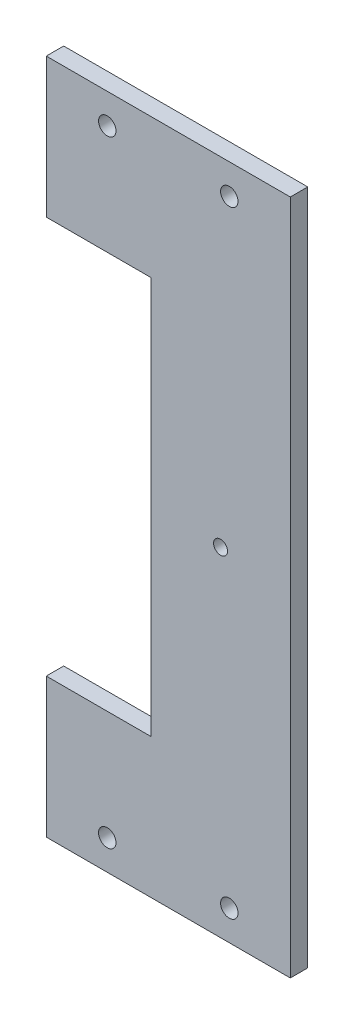
ISO-10303-21;
HEADER;
FILE_DESCRIPTION(('STEP AP214'),'2;1');
FILE_NAME('part.step','',(''),(''),'','','');
FILE_SCHEMA(('AUTOMOTIVE_DESIGN { 1 0 10303 214 1 1 1 1 }'));
ENDSEC;
DATA;
#1=APPLICATION_CONTEXT('core data for automotive mechanical design processes');
#2=APPLICATION_PROTOCOL_DEFINITION('international standard','automotive_design',2000,#1);
#3=PRODUCT_CONTEXT('',#1,'mechanical');
#4=PRODUCT('Part','Part','',(#3));
#5=PRODUCT_RELATED_PRODUCT_CATEGORY('part','',(#4));
#6=PRODUCT_DEFINITION_FORMATION('','',#4);
#7=PRODUCT_DEFINITION_CONTEXT('part definition',#1,'design');
#8=PRODUCT_DEFINITION('design','',#6,#7);
#9=PRODUCT_DEFINITION_SHAPE('','',#8);
#10=(LENGTH_UNIT() NAMED_UNIT(*) SI_UNIT(.MILLI.,.METRE.));
#11=(NAMED_UNIT(*) PLANE_ANGLE_UNIT() SI_UNIT($,.RADIAN.));
#12=(NAMED_UNIT(*) SI_UNIT($,.STERADIAN.) SOLID_ANGLE_UNIT());
#13=UNCERTAINTY_MEASURE_WITH_UNIT(LENGTH_MEASURE(1.E-05),#10,'distance_accuracy_value','');
#14=(GEOMETRIC_REPRESENTATION_CONTEXT(3) GLOBAL_UNCERTAINTY_ASSIGNED_CONTEXT((#13)) GLOBAL_UNIT_ASSIGNED_CONTEXT((#10,
#11,#12)) REPRESENTATION_CONTEXT('',''));
#15=CARTESIAN_POINT('',(0.,0.,0.));
#16=DIRECTION('',(0.,0.,1.));
#17=DIRECTION('',(1.,0.,0.));
#18=AXIS2_PLACEMENT_3D('',#15,#16,#17);
#19=CARTESIAN_POINT('',(0.,0.,5.));
#20=DIRECTION('',(0.,0.,-1.));
#21=DIRECTION('',(-1.,0.,0.));
#22=AXIS2_PLACEMENT_3D('',#19,#20,#21);
#23=PLANE('',#22);
#24=DIRECTION('',(-1.,0.,0.));
#25=VECTOR('',#24,1.);
#26=CARTESIAN_POINT('',(-24.2182890855457,78.1150442477876,5.));
#27=LINE('',#26,#25);
#28=CARTESIAN_POINT('',(45.7817109144543,78.1150442477876,5.));
#29=VERTEX_POINT('',#28);
#30=CARTESIAN_POINT('',(-24.2182890855457,78.1150442477876,5.));
#31=VERTEX_POINT('',#30);
#32=EDGE_CURVE('E145',#29,#31,#27,.T.);
#33=ORIENTED_EDGE('',*,*,#32,.T.);
#34=DIRECTION('',(0.,-1.,0.));
#35=VECTOR('',#34,1.);
#36=CARTESIAN_POINT('',(-24.2182890855457,78.1150442477876,5.));
#37=LINE('',#36,#35);
#38=CARTESIAN_POINT('',(-24.2182890855457,38.1150442477876,5.));
#39=VERTEX_POINT('',#38);
#40=EDGE_CURVE('E93',#31,#39,#37,.T.);
#41=ORIENTED_EDGE('',*,*,#40,.T.);
#42=DIRECTION('',(1.,0.,0.));
#43=VECTOR('',#42,1.);
#44=CARTESIAN_POINT('',(-24.2182890855457,38.1150442477876,5.));
#45=LINE('',#44,#43);
#46=CARTESIAN_POINT('',(5.78171091445426,38.1150442477876,5.));
#47=VERTEX_POINT('',#46);
#48=EDGE_CURVE('E160',#39,#47,#45,.T.);
#49=ORIENTED_EDGE('',*,*,#48,.T.);
#50=DIRECTION('',(0.,-1.,0.));
#51=VECTOR('',#50,1.);
#52=CARTESIAN_POINT('',(5.78171091445426,38.1150442477876,5.));
#53=LINE('',#52,#51);
#54=CARTESIAN_POINT('',(5.78171091445426,-75.8849557522124,5.));
#55=VERTEX_POINT('',#54);
#56=EDGE_CURVE('E173',#47,#55,#53,.T.);
#57=ORIENTED_EDGE('',*,*,#56,.T.);
#58=DIRECTION('',(-1.,0.,0.));
#59=VECTOR('',#58,1.);
#60=CARTESIAN_POINT('',(-24.2182890855457,-75.8849557522124,5.));
#61=LINE('',#60,#59);
#62=CARTESIAN_POINT('',(-24.2182890855457,-75.8849557522124,5.));
#63=VERTEX_POINT('',#62);
#64=EDGE_CURVE('E112',#55,#63,#61,.T.);
#65=ORIENTED_EDGE('',*,*,#64,.T.);
#66=DIRECTION('',(0.,-1.,0.));
#67=VECTOR('',#66,1.);
#68=CARTESIAN_POINT('',(-24.2182890855457,-115.884955752212,5.));
#69=LINE('',#68,#67);
#70=CARTESIAN_POINT('',(-24.2182890855457,-115.884955752212,5.));
#71=VERTEX_POINT('',#70);
#72=EDGE_CURVE('E106',#63,#71,#69,.T.);
#73=ORIENTED_EDGE('',*,*,#72,.T.);
#74=DIRECTION('',(1.,0.,0.));
#75=VECTOR('',#74,1.);
#76=CARTESIAN_POINT('',(-24.2182890855457,-115.884955752212,5.));
#77=LINE('',#76,#75);
#78=CARTESIAN_POINT('',(45.7817109144543,-115.884955752212,5.));
#79=VERTEX_POINT('',#78);
#80=EDGE_CURVE('E110',#71,#79,#77,.T.);
#81=ORIENTED_EDGE('',*,*,#80,.T.);
#82=DIRECTION('',(0.,1.,0.));
#83=VECTOR('',#82,1.);
#84=CARTESIAN_POINT('',(45.7817109144543,78.1150442477876,5.));
#85=LINE('',#84,#83);
#86=EDGE_CURVE('E50',#79,#29,#85,.T.);
#87=ORIENTED_EDGE('',*,*,#86,.T.);
#88=EDGE_LOOP('',(#33,#41,#49,#57,#65,#73,#81,#87));
#89=FACE_BOUND('',#88,.T.);
#90=CARTESIAN_POINT('',(25.7817109144543,-18.8849557522124,5.));
#91=DIRECTION('',(0.,0.,1.));
#92=DIRECTION('',(1.,0.,0.));
#93=AXIS2_PLACEMENT_3D('',#90,#91,#92);
#94=CIRCLE('',#93,2.00000000000001);
#95=CARTESIAN_POINT('',(27.7817109144543,-18.8849557522124,5.));
#96=VERTEX_POINT('',#95);
#97=EDGE_CURVE('E134',#96,#96,#94,.T.);
#98=ORIENTED_EDGE('',*,*,#97,.F.);
#99=EDGE_LOOP('',(#98));
#100=FACE_BOUND('',#99,.T.);
#101=CARTESIAN_POINT('',(-6.71828908554573,-107.285805208705,5.));
#102=DIRECTION('',(0.,0.,1.));
#103=DIRECTION('',(1.,0.,0.));
#104=AXIS2_PLACEMENT_3D('',#101,#102,#103);
#105=CIRCLE('',#104,2.5);
#106=CARTESIAN_POINT('',(-4.21828908554573,-107.285805208705,5.));
#107=VERTEX_POINT('',#106);
#108=EDGE_CURVE('E182',#107,#107,#105,.T.);
#109=ORIENTED_EDGE('',*,*,#108,.F.);
#110=EDGE_LOOP('',(#109));
#111=FACE_BOUND('',#110,.T.);
#112=CARTESIAN_POINT('',(28.2817109144543,-107.285805208705,5.));
#113=DIRECTION('',(0.,0.,1.));
#114=DIRECTION('',(-1.,0.,0.));
#115=AXIS2_PLACEMENT_3D('',#112,#113,#114);
#116=CIRCLE('',#115,2.5);
#117=CARTESIAN_POINT('',(25.7817109144543,-107.285805208705,5.));
#118=VERTEX_POINT('',#117);
#119=EDGE_CURVE('E188',#118,#118,#116,.T.);
#120=ORIENTED_EDGE('',*,*,#119,.F.);
#121=EDGE_LOOP('',(#120));
#122=FACE_BOUND('',#121,.T.);
#123=CARTESIAN_POINT('',(28.2817109144543,69.5158937042806,5.));
#124=DIRECTION('',(0.,0.,1.));
#125=DIRECTION('',(1.,0.,0.));
#126=AXIS2_PLACEMENT_3D('',#123,#124,#125);
#127=CIRCLE('',#126,2.5);
#128=CARTESIAN_POINT('',(30.7817109144543,69.5158937042806,5.));
#129=VERTEX_POINT('',#128);
#130=EDGE_CURVE('E194',#129,#129,#127,.T.);
#131=ORIENTED_EDGE('',*,*,#130,.F.);
#132=EDGE_LOOP('',(#131));
#133=FACE_BOUND('',#132,.T.);
#134=CARTESIAN_POINT('',(-6.71828908554573,69.5158937042806,5.));
#135=DIRECTION('',(0.,0.,1.));
#136=DIRECTION('',(-1.,0.,0.));
#137=AXIS2_PLACEMENT_3D('',#134,#135,#136);
#138=CIRCLE('',#137,2.5);
#139=CARTESIAN_POINT('',(-9.21828908554573,69.5158937042806,5.));
#140=VERTEX_POINT('',#139);
#141=EDGE_CURVE('E200',#140,#140,#138,.T.);
#142=ORIENTED_EDGE('',*,*,#141,.F.);
#143=EDGE_LOOP('',(#142));
#144=FACE_BOUND('',#143,.T.);
#145=ADVANCED_FACE('F33',(#89,#100,#111,#122,#133,#144),#23,.F.);
#146=CARTESIAN_POINT('',(0.,0.,0.));
#147=DIRECTION('',(0.,0.,-1.));
#148=DIRECTION('',(-1.,0.,0.));
#149=AXIS2_PLACEMENT_3D('',#146,#147,#148);
#150=PLANE('',#149);
#151=CARTESIAN_POINT('',(28.2817109144543,69.5158937042806,0.));
#152=DIRECTION('',(0.,0.,1.));
#153=DIRECTION('',(1.,0.,0.));
#154=AXIS2_PLACEMENT_3D('',#151,#152,#153);
#155=CIRCLE('',#154,2.5);
#156=CARTESIAN_POINT('',(30.7817109144543,69.5158937042806,0.));
#157=VERTEX_POINT('',#156);
#158=EDGE_CURVE('E197',#157,#157,#155,.T.);
#159=ORIENTED_EDGE('',*,*,#158,.T.);
#160=EDGE_LOOP('',(#159));
#161=FACE_BOUND('',#160,.T.);
#162=CARTESIAN_POINT('',(-6.71828908554573,-107.285805208705,0.));
#163=DIRECTION('',(0.,0.,1.));
#164=DIRECTION('',(1.,0.,0.));
#165=AXIS2_PLACEMENT_3D('',#162,#163,#164);
#166=CIRCLE('',#165,2.5);
#167=CARTESIAN_POINT('',(-4.21828908554573,-107.285805208705,0.));
#168=VERTEX_POINT('',#167);
#169=EDGE_CURVE('E185',#168,#168,#166,.T.);
#170=ORIENTED_EDGE('',*,*,#169,.T.);
#171=EDGE_LOOP('',(#170));
#172=FACE_BOUND('',#171,.T.);
#173=DIRECTION('',(-1.,0.,0.));
#174=VECTOR('',#173,1.);
#175=CARTESIAN_POINT('',(-24.2182890855457,78.1150442477876,0.));
#176=LINE('',#175,#174);
#177=CARTESIAN_POINT('',(45.7817109144543,78.1150442477876,0.));
#178=VERTEX_POINT('',#177);
#179=CARTESIAN_POINT('',(-24.2182890855457,78.1150442477876,0.));
#180=VERTEX_POINT('',#179);
#181=EDGE_CURVE('E130',#178,#180,#176,.T.);
#182=ORIENTED_EDGE('',*,*,#181,.F.);
#183=DIRECTION('',(0.,1.,0.));
#184=VECTOR('',#183,1.);
#185=CARTESIAN_POINT('',(45.7817109144543,78.1150442477876,0.));
#186=LINE('',#185,#184);
#187=CARTESIAN_POINT('',(45.7817109144543,-115.884955752212,0.));
#188=VERTEX_POINT('',#187);
#189=EDGE_CURVE('E85',#188,#178,#186,.T.);
#190=ORIENTED_EDGE('',*,*,#189,.F.);
#191=DIRECTION('',(1.,0.,0.));
#192=VECTOR('',#191,1.);
#193=CARTESIAN_POINT('',(-24.2182890855457,-115.884955752212,0.));
#194=LINE('',#193,#192);
#195=CARTESIAN_POINT('',(-24.2182890855457,-115.884955752212,0.));
#196=VERTEX_POINT('',#195);
#197=EDGE_CURVE('E79',#196,#188,#194,.T.);
#198=ORIENTED_EDGE('',*,*,#197,.F.);
#199=DIRECTION('',(0.,-1.,0.));
#200=VECTOR('',#199,1.);
#201=CARTESIAN_POINT('',(-24.2182890855457,-115.884955752212,0.));
#202=LINE('',#201,#200);
#203=CARTESIAN_POINT('',(-24.2182890855457,-75.8849557522124,0.));
#204=VERTEX_POINT('',#203);
#205=EDGE_CURVE('E120',#204,#196,#202,.T.);
#206=ORIENTED_EDGE('',*,*,#205,.F.);
#207=DIRECTION('',(-1.,0.,0.));
#208=VECTOR('',#207,1.);
#209=CARTESIAN_POINT('',(-24.2182890855457,-75.8849557522124,0.));
#210=LINE('',#209,#208);
#211=CARTESIAN_POINT('',(5.78171091445426,-75.8849557522124,0.));
#212=VERTEX_POINT('',#211);
#213=EDGE_CURVE('E140',#212,#204,#210,.T.);
#214=ORIENTED_EDGE('',*,*,#213,.F.);
#215=DIRECTION('',(0.,-1.,0.));
#216=VECTOR('',#215,1.);
#217=CARTESIAN_POINT('',(5.78171091445426,38.1150442477876,0.));
#218=LINE('',#217,#216);
#219=CARTESIAN_POINT('',(5.78171091445426,38.1150442477876,0.));
#220=VERTEX_POINT('',#219);
#221=EDGE_CURVE('E138',#220,#212,#218,.T.);
#222=ORIENTED_EDGE('',*,*,#221,.F.);
#223=DIRECTION('',(1.,0.,0.));
#224=VECTOR('',#223,1.);
#225=CARTESIAN_POINT('',(-24.2182890855457,38.1150442477876,0.));
#226=LINE('',#225,#224);
#227=CARTESIAN_POINT('',(-24.2182890855457,38.1150442477876,0.));
#228=VERTEX_POINT('',#227);
#229=EDGE_CURVE('E136',#228,#220,#226,.T.);
#230=ORIENTED_EDGE('',*,*,#229,.F.);
#231=DIRECTION('',(0.,-1.,0.));
#232=VECTOR('',#231,1.);
#233=CARTESIAN_POINT('',(-24.2182890855457,78.1150442477876,0.));
#234=LINE('',#233,#232);
#235=EDGE_CURVE('E133',#180,#228,#234,.T.);
#236=ORIENTED_EDGE('',*,*,#235,.F.);
#237=EDGE_LOOP('',(#182,#190,#198,#206,#214,#222,#230,#236));
#238=FACE_BOUND('',#237,.T.);
#239=CARTESIAN_POINT('',(25.7817109144543,-18.8849557522124,0.));
#240=DIRECTION('',(0.,0.,1.));
#241=DIRECTION('',(1.,0.,0.));
#242=AXIS2_PLACEMENT_3D('',#239,#240,#241);
#243=CIRCLE('',#242,2.00000000000001);
#244=CARTESIAN_POINT('',(27.7817109144543,-18.8849557522124,0.));
#245=VERTEX_POINT('',#244);
#246=EDGE_CURVE('E179',#245,#245,#243,.T.);
#247=ORIENTED_EDGE('',*,*,#246,.T.);
#248=EDGE_LOOP('',(#247));
#249=FACE_BOUND('',#248,.T.);
#250=CARTESIAN_POINT('',(28.2817109144543,-107.285805208705,0.));
#251=DIRECTION('',(0.,0.,1.));
#252=DIRECTION('',(-1.,0.,0.));
#253=AXIS2_PLACEMENT_3D('',#250,#251,#252);
#254=CIRCLE('',#253,2.5);
#255=CARTESIAN_POINT('',(25.7817109144543,-107.285805208705,0.));
#256=VERTEX_POINT('',#255);
#257=EDGE_CURVE('E191',#256,#256,#254,.T.);
#258=ORIENTED_EDGE('',*,*,#257,.T.);
#259=EDGE_LOOP('',(#258));
#260=FACE_BOUND('',#259,.T.);
#261=CARTESIAN_POINT('',(-6.71828908554573,69.5158937042806,0.));
#262=DIRECTION('',(0.,0.,1.));
#263=DIRECTION('',(-1.,0.,0.));
#264=AXIS2_PLACEMENT_3D('',#261,#262,#263);
#265=CIRCLE('',#264,2.5);
#266=CARTESIAN_POINT('',(-9.21828908554573,69.5158937042806,0.));
#267=VERTEX_POINT('',#266);
#268=EDGE_CURVE('E203',#267,#267,#265,.T.);
#269=ORIENTED_EDGE('',*,*,#268,.T.);
#270=EDGE_LOOP('',(#269));
#271=FACE_BOUND('',#270,.T.);
#272=ADVANCED_FACE('F164',(#161,#172,#238,#249,#260,#271),#150,.T.);
#273=CARTESIAN_POINT('',(-24.2182890855457,78.1150442477876,5.));
#274=DIRECTION('',(0.,-1.,0.));
#275=DIRECTION('',(0.,0.,-1.));
#276=AXIS2_PLACEMENT_3D('',#273,#274,#275);
#277=PLANE('',#276);
#278=ORIENTED_EDGE('',*,*,#181,.T.);
#279=DIRECTION('',(0.,0.,-1.));
#280=VECTOR('',#279,1.);
#281=CARTESIAN_POINT('',(-24.2182890855457,78.1150442477876,5.));
#282=LINE('',#281,#280);
#283=EDGE_CURVE('E11',#31,#180,#282,.T.);
#284=ORIENTED_EDGE('',*,*,#283,.F.);
#285=ORIENTED_EDGE('',*,*,#32,.F.);
#286=DIRECTION('',(0.,0.,-1.));
#287=VECTOR('',#286,1.);
#288=CARTESIAN_POINT('',(45.7817109144543,78.1150442477876,5.));
#289=LINE('',#288,#287);
#290=EDGE_CURVE('E126',#29,#178,#289,.T.);
#291=ORIENTED_EDGE('',*,*,#290,.T.);
#292=EDGE_LOOP('',(#278,#284,#285,#291));
#293=FACE_BOUND('',#292,.T.);
#294=ADVANCED_FACE('F35',(#293),#277,.F.);
#295=CARTESIAN_POINT('',(-24.2182890855457,78.1150442477876,5.));
#296=DIRECTION('',(1.,0.,0.));
#297=DIRECTION('',(0.,1.,0.));
#298=AXIS2_PLACEMENT_3D('',#295,#296,#297);
#299=PLANE('',#298);
#300=ORIENTED_EDGE('',*,*,#235,.T.);
#301=DIRECTION('',(0.,0.,-1.));
#302=VECTOR('',#301,1.);
#303=CARTESIAN_POINT('',(-24.2182890855457,38.1150442477876,5.));
#304=LINE('',#303,#302);
#305=EDGE_CURVE('E42',#39,#228,#304,.T.);
#306=ORIENTED_EDGE('',*,*,#305,.F.);
#307=ORIENTED_EDGE('',*,*,#40,.F.);
#308=ORIENTED_EDGE('',*,*,#283,.T.);
#309=EDGE_LOOP('',(#300,#306,#307,#308));
#310=FACE_BOUND('',#309,.T.);
#311=ADVANCED_FACE('F235',(#310),#299,.F.);
#312=CARTESIAN_POINT('',(-24.2182890855457,38.1150442477876,5.));
#313=DIRECTION('',(0.,1.,0.));
#314=DIRECTION('',(0.,0.,1.));
#315=AXIS2_PLACEMENT_3D('',#312,#313,#314);
#316=PLANE('',#315);
#317=ORIENTED_EDGE('',*,*,#229,.T.);
#318=DIRECTION('',(0.,0.,-1.));
#319=VECTOR('',#318,1.);
#320=CARTESIAN_POINT('',(5.78171091445426,38.1150442477876,5.));
#321=LINE('',#320,#319);
#322=EDGE_CURVE('E152',#47,#220,#321,.T.);
#323=ORIENTED_EDGE('',*,*,#322,.F.);
#324=ORIENTED_EDGE('',*,*,#48,.F.);
#325=ORIENTED_EDGE('',*,*,#305,.T.);
#326=EDGE_LOOP('',(#317,#323,#324,#325));
#327=FACE_BOUND('',#326,.T.);
#328=ADVANCED_FACE('F158',(#327),#316,.F.);
#329=CARTESIAN_POINT('',(5.78171091445426,38.1150442477876,5.));
#330=DIRECTION('',(1.,0.,0.));
#331=DIRECTION('',(0.,0.,-1.));
#332=AXIS2_PLACEMENT_3D('',#329,#330,#331);
#333=PLANE('',#332);
#334=ORIENTED_EDGE('',*,*,#221,.T.);
#335=DIRECTION('',(0.,0.,-1.));
#336=VECTOR('',#335,1.);
#337=CARTESIAN_POINT('',(5.78171091445426,-75.8849557522124,5.));
#338=LINE('',#337,#336);
#339=EDGE_CURVE('E149',#55,#212,#338,.T.);
#340=ORIENTED_EDGE('',*,*,#339,.F.);
#341=ORIENTED_EDGE('',*,*,#56,.F.);
#342=ORIENTED_EDGE('',*,*,#322,.T.);
#343=EDGE_LOOP('',(#334,#340,#341,#342));
#344=FACE_BOUND('',#343,.T.);
#345=ADVANCED_FACE('F169',(#344),#333,.F.);
#346=CARTESIAN_POINT('',(-24.2182890855457,-75.8849557522124,5.));
#347=DIRECTION('',(0.,-1.,0.));
#348=DIRECTION('',(0.,0.,-1.));
#349=AXIS2_PLACEMENT_3D('',#346,#347,#348);
#350=PLANE('',#349);
#351=ORIENTED_EDGE('',*,*,#213,.T.);
#352=DIRECTION('',(0.,0.,-1.));
#353=VECTOR('',#352,1.);
#354=CARTESIAN_POINT('',(-24.2182890855457,-75.8849557522124,5.));
#355=LINE('',#354,#353);
#356=EDGE_CURVE('E121',#63,#204,#355,.T.);
#357=ORIENTED_EDGE('',*,*,#356,.F.);
#358=ORIENTED_EDGE('',*,*,#64,.F.);
#359=ORIENTED_EDGE('',*,*,#339,.T.);
#360=EDGE_LOOP('',(#351,#357,#358,#359));
#361=FACE_BOUND('',#360,.T.);
#362=ADVANCED_FACE('F172',(#361),#350,.F.);
#363=CARTESIAN_POINT('',(-24.2182890855457,-115.884955752212,5.));
#364=DIRECTION('',(1.,0.,0.));
#365=DIRECTION('',(0.,1.,0.));
#366=AXIS2_PLACEMENT_3D('',#363,#364,#365);
#367=PLANE('',#366);
#368=ORIENTED_EDGE('',*,*,#205,.T.);
#369=DIRECTION('',(0.,0.,-1.));
#370=VECTOR('',#369,1.);
#371=CARTESIAN_POINT('',(-24.2182890855457,-115.884955752212,5.));
#372=LINE('',#371,#370);
#373=EDGE_CURVE('E117',#71,#196,#372,.T.);
#374=ORIENTED_EDGE('',*,*,#373,.F.);
#375=ORIENTED_EDGE('',*,*,#72,.F.);
#376=ORIENTED_EDGE('',*,*,#356,.T.);
#377=EDGE_LOOP('',(#368,#374,#375,#376));
#378=FACE_BOUND('',#377,.T.);
#379=ADVANCED_FACE('F118',(#378),#367,.F.);
#380=CARTESIAN_POINT('',(-24.2182890855457,-115.884955752212,5.));
#381=DIRECTION('',(0.,1.,0.));
#382=DIRECTION('',(-1.,0.,0.));
#383=AXIS2_PLACEMENT_3D('',#380,#381,#382);
#384=PLANE('',#383);
#385=ORIENTED_EDGE('',*,*,#197,.T.);
#386=DIRECTION('',(0.,0.,-1.));
#387=VECTOR('',#386,1.);
#388=CARTESIAN_POINT('',(45.7817109144543,-115.884955752212,5.));
#389=LINE('',#388,#387);
#390=EDGE_CURVE('E122',#79,#188,#389,.T.);
#391=ORIENTED_EDGE('',*,*,#390,.F.);
#392=ORIENTED_EDGE('',*,*,#80,.F.);
#393=ORIENTED_EDGE('',*,*,#373,.T.);
#394=EDGE_LOOP('',(#385,#391,#392,#393));
#395=FACE_BOUND('',#394,.T.);
#396=ADVANCED_FACE('F124',(#395),#384,.F.);
#397=CARTESIAN_POINT('',(45.7817109144543,78.1150442477876,5.));
#398=DIRECTION('',(-1.,0.,0.));
#399=DIRECTION('',(0.,0.,1.));
#400=AXIS2_PLACEMENT_3D('',#397,#398,#399);
#401=PLANE('',#400);
#402=ORIENTED_EDGE('',*,*,#189,.T.);
#403=ORIENTED_EDGE('',*,*,#290,.F.);
#404=ORIENTED_EDGE('',*,*,#86,.F.);
#405=ORIENTED_EDGE('',*,*,#390,.T.);
#406=EDGE_LOOP('',(#402,#403,#404,#405));
#407=FACE_BOUND('',#406,.T.);
#408=ADVANCED_FACE('F223',(#407),#401,.F.);
#409=CARTESIAN_POINT('',(25.7817109144543,-18.8849557522124,5.));
#410=DIRECTION('',(0.,0.,-1.));
#411=DIRECTION('',(-1.,0.,0.));
#412=AXIS2_PLACEMENT_3D('',#409,#410,#411);
#413=CYLINDRICAL_SURFACE('',#412,2.00000000000001);
#414=ORIENTED_EDGE('',*,*,#97,.T.);
#415=EDGE_LOOP('',(#414));
#416=FACE_BOUND('',#415,.T.);
#417=ORIENTED_EDGE('',*,*,#246,.F.);
#418=EDGE_LOOP('',(#417));
#419=FACE_BOUND('',#418,.T.);
#420=ADVANCED_FACE('F220',(#416,#419),#413,.F.);
#421=CARTESIAN_POINT('',(-6.71828908554573,-107.285805208705,5.));
#422=DIRECTION('',(0.,0.,-1.));
#423=DIRECTION('',(-1.,0.,0.));
#424=AXIS2_PLACEMENT_3D('',#421,#422,#423);
#425=CYLINDRICAL_SURFACE('',#424,2.5);
#426=ORIENTED_EDGE('',*,*,#108,.T.);
#427=EDGE_LOOP('',(#426));
#428=FACE_BOUND('',#427,.T.);
#429=ORIENTED_EDGE('',*,*,#169,.F.);
#430=EDGE_LOOP('',(#429));
#431=FACE_BOUND('',#430,.T.);
#432=ADVANCED_FACE('F299',(#428,#431),#425,.F.);
#433=CARTESIAN_POINT('',(28.2817109144543,-107.285805208705,5.));
#434=DIRECTION('',(0.,0.,-1.));
#435=DIRECTION('',(-1.,0.,0.));
#436=AXIS2_PLACEMENT_3D('',#433,#434,#435);
#437=CYLINDRICAL_SURFACE('',#436,2.5);
#438=ORIENTED_EDGE('',*,*,#119,.T.);
#439=EDGE_LOOP('',(#438));
#440=FACE_BOUND('',#439,.T.);
#441=ORIENTED_EDGE('',*,*,#257,.F.);
#442=EDGE_LOOP('',(#441));
#443=FACE_BOUND('',#442,.T.);
#444=ADVANCED_FACE('F307',(#440,#443),#437,.F.);
#445=CARTESIAN_POINT('',(28.2817109144543,69.5158937042806,5.));
#446=DIRECTION('',(0.,0.,-1.));
#447=DIRECTION('',(-1.,0.,0.));
#448=AXIS2_PLACEMENT_3D('',#445,#446,#447);
#449=CYLINDRICAL_SURFACE('',#448,2.5);
#450=ORIENTED_EDGE('',*,*,#130,.T.);
#451=EDGE_LOOP('',(#450));
#452=FACE_BOUND('',#451,.T.);
#453=ORIENTED_EDGE('',*,*,#158,.F.);
#454=EDGE_LOOP('',(#453));
#455=FACE_BOUND('',#454,.T.);
#456=ADVANCED_FACE('F315',(#452,#455),#449,.F.);
#457=CARTESIAN_POINT('',(-6.71828908554573,69.5158937042806,5.));
#458=DIRECTION('',(0.,0.,-1.));
#459=DIRECTION('',(-1.,0.,0.));
#460=AXIS2_PLACEMENT_3D('',#457,#458,#459);
#461=CYLINDRICAL_SURFACE('',#460,2.5);
#462=ORIENTED_EDGE('',*,*,#141,.T.);
#463=EDGE_LOOP('',(#462));
#464=FACE_BOUND('',#463,.T.);
#465=ORIENTED_EDGE('',*,*,#268,.F.);
#466=EDGE_LOOP('',(#465));
#467=FACE_BOUND('',#466,.T.);
#468=ADVANCED_FACE('F209',(#464,#467),#461,.F.);
#469=CLOSED_SHELL('',(#145,#272,#294,#311,#328,#345,#362,#379,#396,#408,#420,#432,#444,#456,#468));
#470=MANIFOLD_SOLID_BREP('B2',#469);
#471=ADVANCED_BREP_SHAPE_REPRESENTATION('',(#18,#470),#14);
#472=SHAPE_DEFINITION_REPRESENTATION(#9,#471);
ENDSEC;
END-ISO-10303-21;
